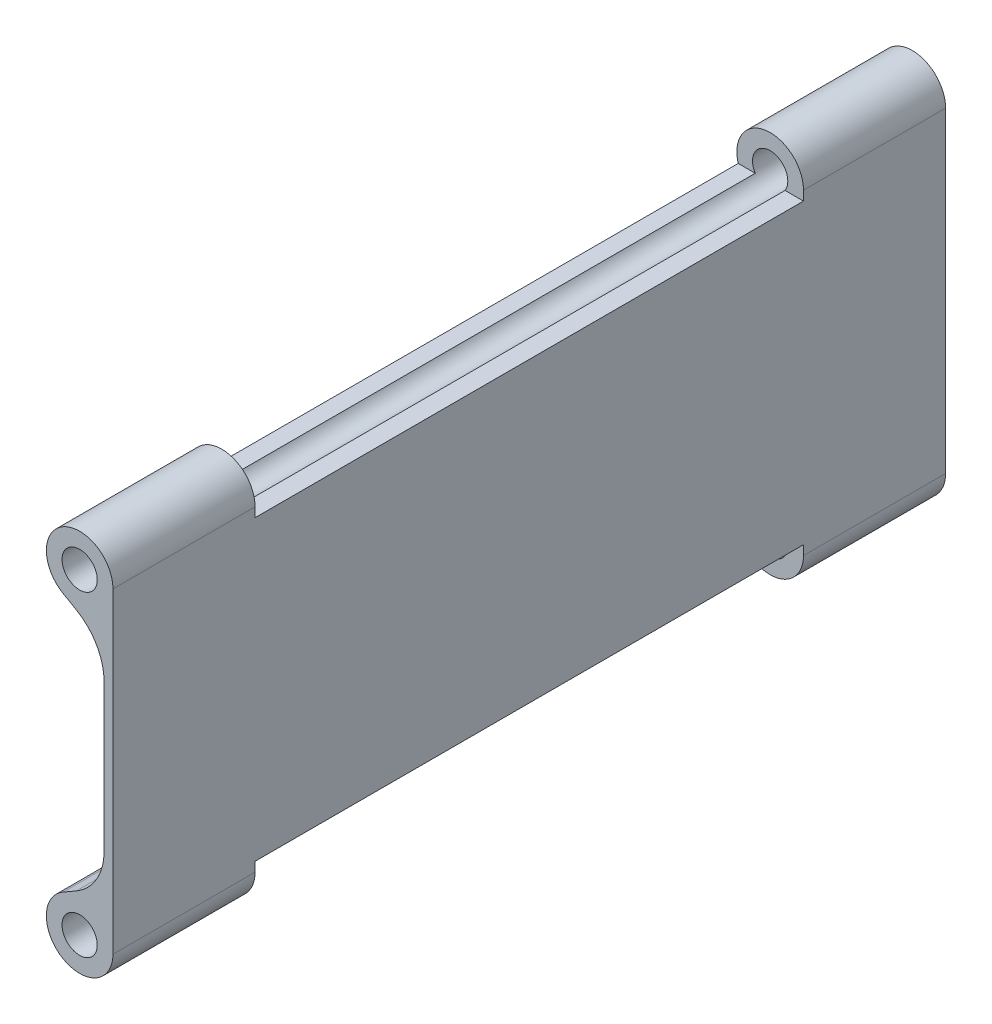
ISO-10303-21;
HEADER;
FILE_DESCRIPTION(('STEP AP214'),'2;1');
FILE_NAME('part.step','',(''),(''),'','','');
FILE_SCHEMA(('AUTOMOTIVE_DESIGN { 1 0 10303 214 1 1 1 1 }'));
ENDSEC;
DATA;
#1=APPLICATION_CONTEXT('core data for automotive mechanical design processes');
#2=APPLICATION_PROTOCOL_DEFINITION('international standard','automotive_design',2000,#1);
#3=PRODUCT_CONTEXT('',#1,'mechanical');
#4=PRODUCT('Part','Part','',(#3));
#5=PRODUCT_RELATED_PRODUCT_CATEGORY('part','',(#4));
#6=PRODUCT_DEFINITION_FORMATION('','',#4);
#7=PRODUCT_DEFINITION_CONTEXT('part definition',#1,'design');
#8=PRODUCT_DEFINITION('design','',#6,#7);
#9=PRODUCT_DEFINITION_SHAPE('','',#8);
#10=(LENGTH_UNIT() NAMED_UNIT(*) SI_UNIT(.MILLI.,.METRE.));
#11=(NAMED_UNIT(*) PLANE_ANGLE_UNIT() SI_UNIT($,.RADIAN.));
#12=(NAMED_UNIT(*) SI_UNIT($,.STERADIAN.) SOLID_ANGLE_UNIT());
#13=UNCERTAINTY_MEASURE_WITH_UNIT(LENGTH_MEASURE(1.E-05),#10,'distance_accuracy_value','');
#14=(GEOMETRIC_REPRESENTATION_CONTEXT(3) GLOBAL_UNCERTAINTY_ASSIGNED_CONTEXT((#13)) GLOBAL_UNIT_ASSIGNED_CONTEXT((#10,
#11,#12)) REPRESENTATION_CONTEXT('',''));
#15=CARTESIAN_POINT('',(0.,0.,0.));
#16=DIRECTION('',(0.,0.,1.));
#17=DIRECTION('',(1.,0.,0.));
#18=AXIS2_PLACEMENT_3D('',#15,#16,#17);
#19=CARTESIAN_POINT('',(-6.,28.5,-150.));
#20=DIRECTION('',(0.,0.,1.));
#21=DIRECTION('',(1.,0.,0.));
#22=AXIS2_PLACEMENT_3D('',#19,#20,#21);
#23=CYLINDRICAL_SURFACE('',#22,6.);
#24=CARTESIAN_POINT('',(-6.,28.5,-25.604093846782));
#25=DIRECTION('',(0.,0.,1.));
#26=DIRECTION('',(0.,-1.,0.));
#27=AXIS2_PLACEMENT_3D('',#24,#25,#26);
#28=CIRCLE('',#27,6.);
#29=CARTESIAN_POINT('',(-11.7548405846867,26.8024105782486,-25.604093846782));
#30=VERTEX_POINT('',#29);
#31=CARTESIAN_POINT('',(0.,28.5,-25.604093846782));
#32=VERTEX_POINT('',#31);
#33=EDGE_CURVE('E230',#30,#32,#28,.F.);
#34=ORIENTED_EDGE('',*,*,#33,.F.);
#35=DIRECTION('',(0.,0.,1.));
#36=VECTOR('',#35,1.);
#37=CARTESIAN_POINT('',(-11.7548405846867,26.8024105782486,-150.));
#38=LINE('',#37,#36);
#39=CARTESIAN_POINT('',(-11.7548405846867,26.8024105782486,-124.395906153218));
#40=VERTEX_POINT('',#39);
#41=EDGE_CURVE('E224',#40,#30,#38,.T.);
#42=ORIENTED_EDGE('',*,*,#41,.F.);
#43=CARTESIAN_POINT('',(-6.,28.5,-124.395906153218));
#44=DIRECTION('',(0.,0.,-1.));
#45=DIRECTION('',(-1.,0.,0.));
#46=AXIS2_PLACEMENT_3D('',#43,#44,#45);
#47=CIRCLE('',#46,6.);
#48=CARTESIAN_POINT('',(0.,28.5,-124.395906153218));
#49=VERTEX_POINT('',#48);
#50=EDGE_CURVE('E227',#49,#40,#47,.F.);
#51=ORIENTED_EDGE('',*,*,#50,.F.);
#52=DIRECTION('',(0.,0.,1.));
#53=VECTOR('',#52,1.);
#54=CARTESIAN_POINT('',(0.,28.5,-150.));
#55=LINE('',#54,#53);
#56=CARTESIAN_POINT('',(0.,28.5,-150.));
#57=VERTEX_POINT('',#56);
#58=EDGE_CURVE('E189',#57,#49,#55,.T.);
#59=ORIENTED_EDGE('',*,*,#58,.F.);
#60=CARTESIAN_POINT('',(-6.,28.5,-150.));
#61=DIRECTION('',(0.,0.,1.));
#62=DIRECTION('',(1.,0.,0.));
#63=AXIS2_PLACEMENT_3D('',#60,#61,#62);
#64=CIRCLE('',#63,6.);
#65=CARTESIAN_POINT('',(-8.98691390995377,23.2963142586697,-150.));
#66=VERTEX_POINT('',#65);
#67=EDGE_CURVE('E250',#57,#66,#64,.T.);
#68=ORIENTED_EDGE('',*,*,#67,.T.);
#69=DIRECTION('',(0.,0.,1.));
#70=VECTOR('',#69,1.);
#71=CARTESIAN_POINT('',(-8.98691390995377,23.2963142586697,-150.));
#72=LINE('',#71,#70);
#73=CARTESIAN_POINT('',(-8.98691390995377,23.2963142586697,0.));
#74=VERTEX_POINT('',#73);
#75=EDGE_CURVE('E273',#66,#74,#72,.T.);
#76=ORIENTED_EDGE('',*,*,#75,.T.);
#77=CARTESIAN_POINT('',(-6.,28.5,0.));
#78=DIRECTION('',(0.,0.,1.));
#79=DIRECTION('',(1.,0.,0.));
#80=AXIS2_PLACEMENT_3D('',#77,#78,#79);
#81=CIRCLE('',#80,6.);
#82=CARTESIAN_POINT('',(0.,28.5,0.));
#83=VERTEX_POINT('',#82);
#84=EDGE_CURVE('E246',#83,#74,#81,.T.);
#85=ORIENTED_EDGE('',*,*,#84,.F.);
#86=EDGE_CURVE('E298',#32,#83,#55,.T.);
#87=ORIENTED_EDGE('',*,*,#86,.F.);
#88=EDGE_LOOP('',(#34,#42,#51,#59,#68,#76,#85,#87));
#89=FACE_BOUND('',#88,.T.);
#90=ADVANCED_FACE('F39',(#89),#23,.T.);
#91=CARTESIAN_POINT('',(0.,28.5,-150.));
#92=DIRECTION('',(1.,0.,0.));
#93=DIRECTION('',(0.,0.,-1.));
#94=AXIS2_PLACEMENT_3D('',#91,#92,#93);
#95=PLANE('',#94);
#96=DIRECTION('',(0.,-1.,0.));
#97=VECTOR('',#96,1.);
#98=CARTESIAN_POINT('',(0.,44.9478454916756,-25.604093846782));
#99=LINE('',#98,#97);
#100=CARTESIAN_POINT('',(0.,26.8024105782486,-25.604093846782));
#101=VERTEX_POINT('',#100);
#102=EDGE_CURVE('E185',#32,#101,#99,.T.);
#103=ORIENTED_EDGE('',*,*,#102,.F.);
#104=ORIENTED_EDGE('',*,*,#86,.T.);
#105=DIRECTION('',(0.,1.,0.));
#106=VECTOR('',#105,1.);
#107=CARTESIAN_POINT('',(0.,28.5,0.));
#108=LINE('',#107,#106);
#109=CARTESIAN_POINT('',(0.,-28.5,0.));
#110=VERTEX_POINT('',#109);
#111=EDGE_CURVE('E255',#110,#83,#108,.T.);
#112=ORIENTED_EDGE('',*,*,#111,.F.);
#113=DIRECTION('',(0.,0.,1.));
#114=VECTOR('',#113,1.);
#115=CARTESIAN_POINT('',(0.,-28.5,-150.));
#116=LINE('',#115,#114);
#117=CARTESIAN_POINT('',(0.,-28.5,-25.604093846782));
#118=VERTEX_POINT('',#117);
#119=EDGE_CURVE('E302',#118,#110,#116,.T.);
#120=ORIENTED_EDGE('',*,*,#119,.F.);
#121=DIRECTION('',(0.,-1.,0.));
#122=VECTOR('',#121,1.);
#123=CARTESIAN_POINT('',(0.,-44.9478454916756,-25.604093846782));
#124=LINE('',#123,#122);
#125=CARTESIAN_POINT('',(0.,-26.8024105782486,-25.604093846782));
#126=VERTEX_POINT('',#125);
#127=EDGE_CURVE('E204',#126,#118,#124,.T.);
#128=ORIENTED_EDGE('',*,*,#127,.F.);
#129=DIRECTION('',(0.,0.,1.));
#130=VECTOR('',#129,1.);
#131=CARTESIAN_POINT('',(0.,-26.8024105782486,-25.604093846782));
#132=LINE('',#131,#130);
#133=CARTESIAN_POINT('',(0.,-26.8024105782486,-124.395906153218));
#134=VERTEX_POINT('',#133);
#135=EDGE_CURVE('E200',#134,#126,#132,.T.);
#136=ORIENTED_EDGE('',*,*,#135,.F.);
#137=DIRECTION('',(0.,1.,0.));
#138=VECTOR('',#137,1.);
#139=CARTESIAN_POINT('',(0.,-44.9478454916756,-124.395906153218));
#140=LINE('',#139,#138);
#141=CARTESIAN_POINT('',(0.,-28.5,-124.395906153218));
#142=VERTEX_POINT('',#141);
#143=EDGE_CURVE('E196',#142,#134,#140,.T.);
#144=ORIENTED_EDGE('',*,*,#143,.F.);
#145=CARTESIAN_POINT('',(0.,-28.5,-150.));
#146=VERTEX_POINT('',#145);
#147=EDGE_CURVE('E299',#146,#142,#116,.T.);
#148=ORIENTED_EDGE('',*,*,#147,.F.);
#149=DIRECTION('',(0.,1.,0.));
#150=VECTOR('',#149,1.);
#151=CARTESIAN_POINT('',(0.,28.5,-150.));
#152=LINE('',#151,#150);
#153=EDGE_CURVE('E270',#146,#57,#152,.T.);
#154=ORIENTED_EDGE('',*,*,#153,.T.);
#155=ORIENTED_EDGE('',*,*,#58,.T.);
#156=DIRECTION('',(0.,1.,0.));
#157=VECTOR('',#156,1.);
#158=CARTESIAN_POINT('',(0.,44.9478454916756,-124.395906153218));
#159=LINE('',#158,#157);
#160=CARTESIAN_POINT('',(0.,26.8024105782486,-124.395906153218));
#161=VERTEX_POINT('',#160);
#162=EDGE_CURVE('E170',#161,#49,#159,.T.);
#163=ORIENTED_EDGE('',*,*,#162,.F.);
#164=DIRECTION('',(0.,0.,-1.));
#165=VECTOR('',#164,1.);
#166=CARTESIAN_POINT('',(0.,26.8024105782486,-25.604093846782));
#167=LINE('',#166,#165);
#168=EDGE_CURVE('E180',#101,#161,#167,.T.);
#169=ORIENTED_EDGE('',*,*,#168,.F.);
#170=EDGE_LOOP('',(#103,#104,#112,#120,#128,#136,#144,#148,#154,#155,#163,#169));
#171=FACE_BOUND('',#170,.T.);
#172=ADVANCED_FACE('F187',(#171),#95,.T.);
#173=CARTESIAN_POINT('',(-6.,-28.5,-150.));
#174=DIRECTION('',(0.,0.,1.));
#175=DIRECTION('',(1.,0.,0.));
#176=AXIS2_PLACEMENT_3D('',#173,#174,#175);
#177=CYLINDRICAL_SURFACE('',#176,6.);
#178=CARTESIAN_POINT('',(-6.,-28.5,-124.395906153218));
#179=DIRECTION('',(0.,0.,-1.));
#180=DIRECTION('',(-1.,0.,0.));
#181=AXIS2_PLACEMENT_3D('',#178,#179,#180);
#182=CIRCLE('',#181,6.);
#183=CARTESIAN_POINT('',(-11.7548405846867,-26.8024105782486,-124.395906153218));
#184=VERTEX_POINT('',#183);
#185=EDGE_CURVE('E63',#184,#142,#182,.F.);
#186=ORIENTED_EDGE('',*,*,#185,.F.);
#187=DIRECTION('',(0.,0.,1.));
#188=VECTOR('',#187,1.);
#189=CARTESIAN_POINT('',(-11.7548405846867,-26.8024105782486,-150.));
#190=LINE('',#189,#188);
#191=CARTESIAN_POINT('',(-11.7548405846867,-26.8024105782486,-25.604093846782));
#192=VERTEX_POINT('',#191);
#193=EDGE_CURVE('E217',#192,#184,#190,.F.);
#194=ORIENTED_EDGE('',*,*,#193,.F.);
#195=CARTESIAN_POINT('',(-6.,-28.5,-25.604093846782));
#196=DIRECTION('',(0.,0.,1.));
#197=DIRECTION('',(1.,0.,0.));
#198=AXIS2_PLACEMENT_3D('',#195,#196,#197);
#199=CIRCLE('',#198,6.);
#200=EDGE_CURVE('E221',#118,#192,#199,.F.);
#201=ORIENTED_EDGE('',*,*,#200,.F.);
#202=ORIENTED_EDGE('',*,*,#119,.T.);
#203=CARTESIAN_POINT('',(-6.,-28.5,0.));
#204=DIRECTION('',(0.,0.,1.));
#205=DIRECTION('',(-1.,0.,0.));
#206=AXIS2_PLACEMENT_3D('',#203,#204,#205);
#207=CIRCLE('',#206,6.);
#208=CARTESIAN_POINT('',(-8.98691390995377,-23.2963142586697,0.));
#209=VERTEX_POINT('',#208);
#210=EDGE_CURVE('E288',#209,#110,#207,.T.);
#211=ORIENTED_EDGE('',*,*,#210,.F.);
#212=DIRECTION('',(0.,0.,1.));
#213=VECTOR('',#212,1.);
#214=CARTESIAN_POINT('',(-8.98691390995377,-23.2963142586697,-150.));
#215=LINE('',#214,#213);
#216=CARTESIAN_POINT('',(-8.98691390995377,-23.2963142586697,-150.));
#217=VERTEX_POINT('',#216);
#218=EDGE_CURVE('E303',#217,#209,#215,.T.);
#219=ORIENTED_EDGE('',*,*,#218,.F.);
#220=CARTESIAN_POINT('',(-6.,-28.5,-150.));
#221=DIRECTION('',(0.,0.,1.));
#222=DIRECTION('',(-1.,0.,0.));
#223=AXIS2_PLACEMENT_3D('',#220,#221,#222);
#224=CIRCLE('',#223,6.);
#225=EDGE_CURVE('E266',#217,#146,#224,.T.);
#226=ORIENTED_EDGE('',*,*,#225,.T.);
#227=ORIENTED_EDGE('',*,*,#147,.T.);
#228=EDGE_LOOP('',(#186,#194,#201,#202,#211,#219,#226,#227));
#229=FACE_BOUND('',#228,.T.);
#230=ADVANCED_FACE('F384',(#229),#177,.T.);
#231=CARTESIAN_POINT('',(-1.59999999999999,-19.056228095505,-150.));
#232=DIRECTION('',(-0.497818984992297,0.867280956888389,0.));
#233=DIRECTION('',(-0.867280956888389,-0.497818984992297,0.));
#234=AXIS2_PLACEMENT_3D('',#231,#232,#233);
#235=PLANE('',#234);
#236=DIRECTION('',(-0.867280956888389,-0.497818984992297,0.));
#237=VECTOR('',#236,1.);
#238=CARTESIAN_POINT('',(-1.59999999999999,-19.056228095505,0.));
#239=LINE('',#238,#237);
#240=CARTESIAN_POINT('',(-6.62181015007702,-21.9387454756913,0.));
#241=VERTEX_POINT('',#240);
#242=EDGE_CURVE('E285',#241,#209,#239,.T.);
#243=ORIENTED_EDGE('',*,*,#242,.F.);
#244=DIRECTION('',(0.,0.,1.));
#245=VECTOR('',#244,1.);
#246=CARTESIAN_POINT('',(-6.62181015007702,-21.9387454756913,-150.));
#247=LINE('',#246,#245);
#248=CARTESIAN_POINT('',(-6.62181015007702,-21.9387454756913,-150.));
#249=VERTEX_POINT('',#248);
#250=EDGE_CURVE('E315',#241,#249,#247,.F.);
#251=ORIENTED_EDGE('',*,*,#250,.T.);
#252=DIRECTION('',(-0.867280956888389,-0.497818984992297,0.));
#253=VECTOR('',#252,1.);
#254=CARTESIAN_POINT('',(-1.59999999999999,-19.056228095505,-150.));
#255=LINE('',#254,#253);
#256=EDGE_CURVE('E263',#249,#217,#255,.T.);
#257=ORIENTED_EDGE('',*,*,#256,.T.);
#258=ORIENTED_EDGE('',*,*,#218,.T.);
#259=EDGE_LOOP('',(#243,#251,#257,#258));
#260=FACE_BOUND('',#259,.T.);
#261=ADVANCED_FACE('F453',(#260),#235,.T.);
#262=CARTESIAN_POINT('',(-1.59999999999999,19.056228095505,-150.));
#263=DIRECTION('',(-1.,0.,0.));
#264=DIRECTION('',(0.,0.,1.));
#265=AXIS2_PLACEMENT_3D('',#262,#263,#264);
#266=PLANE('',#265);
#267=DIRECTION('',(0.,-1.,0.));
#268=VECTOR('',#267,1.);
#269=CARTESIAN_POINT('',(-1.59999999999999,19.056228095505,-150.));
#270=LINE('',#269,#268);
#271=CARTESIAN_POINT('',(-1.59999999999999,13.2659359068074,-150.));
#272=VERTEX_POINT('',#271);
#273=CARTESIAN_POINT('',(-1.59999999999999,-13.2659359068074,-150.));
#274=VERTEX_POINT('',#273);
#275=EDGE_CURVE('E259',#272,#274,#270,.T.);
#276=ORIENTED_EDGE('',*,*,#275,.T.);
#277=DIRECTION('',(0.,0.,1.));
#278=VECTOR('',#277,1.);
#279=CARTESIAN_POINT('',(-1.59999999999999,-13.2659359068074,0.));
#280=LINE('',#279,#278);
#281=CARTESIAN_POINT('',(-1.59999999999999,-13.2659359068074,0.));
#282=VERTEX_POINT('',#281);
#283=EDGE_CURVE('E311',#274,#282,#280,.T.);
#284=ORIENTED_EDGE('',*,*,#283,.T.);
#285=DIRECTION('',(0.,-1.,0.));
#286=VECTOR('',#285,1.);
#287=CARTESIAN_POINT('',(-1.59999999999999,19.056228095505,0.));
#288=LINE('',#287,#286);
#289=CARTESIAN_POINT('',(-1.59999999999999,13.2659359068074,0.));
#290=VERTEX_POINT('',#289);
#291=EDGE_CURVE('E281',#290,#282,#288,.T.);
#292=ORIENTED_EDGE('',*,*,#291,.F.);
#293=DIRECTION('',(0.,0.,1.));
#294=VECTOR('',#293,1.);
#295=CARTESIAN_POINT('',(-1.59999999999999,13.2659359068074,-150.));
#296=LINE('',#295,#294);
#297=EDGE_CURVE('E297',#290,#272,#296,.F.);
#298=ORIENTED_EDGE('',*,*,#297,.T.);
#299=EDGE_LOOP('',(#276,#284,#292,#298));
#300=FACE_BOUND('',#299,.T.);
#301=ADVANCED_FACE('F448',(#300),#266,.T.);
#302=CARTESIAN_POINT('',(-1.59999999999999,19.056228095505,-150.));
#303=DIRECTION('',(-0.497818984992297,-0.867280956888389,0.));
#304=DIRECTION('',(0.867280956888389,-0.497818984992297,0.));
#305=AXIS2_PLACEMENT_3D('',#302,#303,#304);
#306=PLANE('',#305);
#307=DIRECTION('',(0.867280956888389,-0.497818984992297,0.));
#308=VECTOR('',#307,1.);
#309=CARTESIAN_POINT('',(-1.59999999999999,19.056228095505,-150.));
#310=LINE('',#309,#308);
#311=CARTESIAN_POINT('',(-6.62181015007702,21.9387454756913,-150.));
#312=VERTEX_POINT('',#311);
#313=EDGE_CURVE('E254',#66,#312,#310,.T.);
#314=ORIENTED_EDGE('',*,*,#313,.T.);
#315=DIRECTION('',(0.,0.,1.));
#316=VECTOR('',#315,1.);
#317=CARTESIAN_POINT('',(-6.62181015007702,21.9387454756913,0.));
#318=LINE('',#317,#316);
#319=CARTESIAN_POINT('',(-6.62181015007702,21.9387454756913,0.));
#320=VERTEX_POINT('',#319);
#321=EDGE_CURVE('E318',#312,#320,#318,.T.);
#322=ORIENTED_EDGE('',*,*,#321,.T.);
#323=DIRECTION('',(0.867280956888389,-0.497818984992297,0.));
#324=VECTOR('',#323,1.);
#325=CARTESIAN_POINT('',(-1.59999999999999,19.056228095505,0.));
#326=LINE('',#325,#324);
#327=EDGE_CURVE('E277',#74,#320,#326,.T.);
#328=ORIENTED_EDGE('',*,*,#327,.F.);
#329=ORIENTED_EDGE('',*,*,#75,.F.);
#330=EDGE_LOOP('',(#314,#322,#328,#329));
#331=FACE_BOUND('',#330,.T.);
#332=ADVANCED_FACE('F432',(#331),#306,.T.);
#333=CARTESIAN_POINT('',(-6.,28.5,-150.));
#334=DIRECTION('',(0.,0.,1.));
#335=DIRECTION('',(1.,0.,0.));
#336=AXIS2_PLACEMENT_3D('',#333,#334,#335);
#337=PLANE('',#336);
#338=CARTESIAN_POINT('',(-6.,-28.5,-150.));
#339=DIRECTION('',(0.,0.,1.));
#340=DIRECTION('',(-1.,0.,0.));
#341=AXIS2_PLACEMENT_3D('',#338,#339,#340);
#342=CIRCLE('',#341,3.175);
#343=CARTESIAN_POINT('',(-9.175,-28.5,-150.));
#344=VERTEX_POINT('',#343);
#345=EDGE_CURVE('E234',#344,#344,#342,.T.);
#346=ORIENTED_EDGE('',*,*,#345,.T.);
#347=EDGE_LOOP('',(#346));
#348=FACE_BOUND('',#347,.T.);
#349=CARTESIAN_POINT('',(-6.,28.5,-150.));
#350=DIRECTION('',(0.,0.,1.));
#351=DIRECTION('',(1.,0.,0.));
#352=AXIS2_PLACEMENT_3D('',#349,#350,#351);
#353=CIRCLE('',#352,3.175);
#354=CARTESIAN_POINT('',(-2.825,28.5,-150.));
#355=VERTEX_POINT('',#354);
#356=EDGE_CURVE('E242',#355,#355,#353,.T.);
#357=ORIENTED_EDGE('',*,*,#356,.T.);
#358=EDGE_LOOP('',(#357));
#359=FACE_BOUND('',#358,.T.);
#360=ORIENTED_EDGE('',*,*,#67,.F.);
#361=ORIENTED_EDGE('',*,*,#153,.F.);
#362=ORIENTED_EDGE('',*,*,#225,.F.);
#363=ORIENTED_EDGE('',*,*,#256,.F.);
#364=CARTESIAN_POINT('',(-11.6,-13.2659359068074,-150.));
#365=DIRECTION('',(0.,0.,1.));
#366=DIRECTION('',(1.,0.,0.));
#367=AXIS2_PLACEMENT_3D('',#364,#365,#366);
#368=CIRCLE('',#367,10.);
#369=EDGE_CURVE('E325',#249,#274,#368,.T.);
#370=ORIENTED_EDGE('',*,*,#369,.T.);
#371=ORIENTED_EDGE('',*,*,#275,.F.);
#372=CARTESIAN_POINT('',(-11.6,13.2659359068074,-150.));
#373=DIRECTION('',(0.,0.,1.));
#374=DIRECTION('',(1.,0.,0.));
#375=AXIS2_PLACEMENT_3D('',#372,#373,#374);
#376=CIRCLE('',#375,10.);
#377=EDGE_CURVE('E331',#272,#312,#376,.T.);
#378=ORIENTED_EDGE('',*,*,#377,.T.);
#379=ORIENTED_EDGE('',*,*,#313,.F.);
#380=EDGE_LOOP('',(#360,#361,#362,#363,#370,#371,#378,#379));
#381=FACE_BOUND('',#380,.T.);
#382=ADVANCED_FACE('F408',(#348,#359,#381),#337,.F.);
#383=CARTESIAN_POINT('',(-6.,28.5,0.));
#384=DIRECTION('',(0.,0.,1.));
#385=DIRECTION('',(1.,0.,0.));
#386=AXIS2_PLACEMENT_3D('',#383,#384,#385);
#387=PLANE('',#386);
#388=CARTESIAN_POINT('',(-6.,-28.5,0.));
#389=DIRECTION('',(0.,0.,1.));
#390=DIRECTION('',(-1.,0.,0.));
#391=AXIS2_PLACEMENT_3D('',#388,#389,#390);
#392=CIRCLE('',#391,3.175);
#393=CARTESIAN_POINT('',(-9.175,-28.5,0.));
#394=VERTEX_POINT('',#393);
#395=EDGE_CURVE('E233',#394,#394,#392,.T.);
#396=ORIENTED_EDGE('',*,*,#395,.F.);
#397=EDGE_LOOP('',(#396));
#398=FACE_BOUND('',#397,.T.);
#399=CARTESIAN_POINT('',(-6.,28.5,0.));
#400=DIRECTION('',(0.,0.,1.));
#401=DIRECTION('',(1.,0.,0.));
#402=AXIS2_PLACEMENT_3D('',#399,#400,#401);
#403=CIRCLE('',#402,3.175);
#404=CARTESIAN_POINT('',(-2.825,28.5,0.));
#405=VERTEX_POINT('',#404);
#406=EDGE_CURVE('E238',#405,#405,#403,.T.);
#407=ORIENTED_EDGE('',*,*,#406,.F.);
#408=EDGE_LOOP('',(#407));
#409=FACE_BOUND('',#408,.T.);
#410=ORIENTED_EDGE('',*,*,#84,.T.);
#411=ORIENTED_EDGE('',*,*,#327,.T.);
#412=CARTESIAN_POINT('',(-11.6,13.2659359068074,0.));
#413=DIRECTION('',(0.,0.,1.));
#414=DIRECTION('',(1.,0.,0.));
#415=AXIS2_PLACEMENT_3D('',#412,#413,#414);
#416=CIRCLE('',#415,10.);
#417=EDGE_CURVE('E328',#320,#290,#416,.F.);
#418=ORIENTED_EDGE('',*,*,#417,.T.);
#419=ORIENTED_EDGE('',*,*,#291,.T.);
#420=CARTESIAN_POINT('',(-11.6,-13.2659359068074,0.));
#421=DIRECTION('',(0.,0.,1.));
#422=DIRECTION('',(1.,0.,0.));
#423=AXIS2_PLACEMENT_3D('',#420,#421,#422);
#424=CIRCLE('',#423,10.);
#425=EDGE_CURVE('E322',#282,#241,#424,.F.);
#426=ORIENTED_EDGE('',*,*,#425,.T.);
#427=ORIENTED_EDGE('',*,*,#242,.T.);
#428=ORIENTED_EDGE('',*,*,#210,.T.);
#429=ORIENTED_EDGE('',*,*,#111,.T.);
#430=EDGE_LOOP('',(#410,#411,#418,#419,#426,#427,#428,#429));
#431=FACE_BOUND('',#430,.T.);
#432=ADVANCED_FACE('F399',(#398,#409,#431),#387,.T.);
#433=CARTESIAN_POINT('',(-6.,28.5,-150.));
#434=DIRECTION('',(0.,0.,1.));
#435=DIRECTION('',(1.,0.,0.));
#436=AXIS2_PLACEMENT_3D('',#433,#434,#435);
#437=CYLINDRICAL_SURFACE('',#436,3.175);
#438=CARTESIAN_POINT('',(-6.,28.5,-25.604093846782));
#439=DIRECTION('',(0.,0.,1.));
#440=DIRECTION('',(0.,-1.,0.));
#441=AXIS2_PLACEMENT_3D('',#438,#439,#440);
#442=CIRCLE('',#441,3.175);
#443=CARTESIAN_POINT('',(-8.68306078111506,26.8024105782486,-25.604093846782));
#444=VERTEX_POINT('',#443);
#445=CARTESIAN_POINT('',(-3.31693921888494,26.8024105782486,-25.604093846782));
#446=VERTEX_POINT('',#445);
#447=EDGE_CURVE('E48',#444,#446,#442,.F.);
#448=ORIENTED_EDGE('',*,*,#447,.T.);
#449=DIRECTION('',(0.,0.,1.));
#450=VECTOR('',#449,1.);
#451=CARTESIAN_POINT('',(-3.31693921888494,26.8024105782486,-150.));
#452=LINE('',#451,#450);
#453=CARTESIAN_POINT('',(-3.31693921888494,26.8024105782486,-124.395906153218));
#454=VERTEX_POINT('',#453);
#455=EDGE_CURVE('E11',#446,#454,#452,.F.);
#456=ORIENTED_EDGE('',*,*,#455,.T.);
#457=CARTESIAN_POINT('',(-6.,28.5,-124.395906153218));
#458=DIRECTION('',(0.,0.,-1.));
#459=DIRECTION('',(-1.,0.,0.));
#460=AXIS2_PLACEMENT_3D('',#457,#458,#459);
#461=CIRCLE('',#460,3.175);
#462=CARTESIAN_POINT('',(-8.68306078111506,26.8024105782486,-124.395906153218));
#463=VERTEX_POINT('',#462);
#464=EDGE_CURVE('E174',#454,#463,#461,.F.);
#465=ORIENTED_EDGE('',*,*,#464,.T.);
#466=DIRECTION('',(0.,0.,1.));
#467=VECTOR('',#466,1.);
#468=CARTESIAN_POINT('',(-8.68306078111506,26.8024105782486,-150.));
#469=LINE('',#468,#467);
#470=EDGE_CURVE('E350',#463,#444,#469,.T.);
#471=ORIENTED_EDGE('',*,*,#470,.T.);
#472=EDGE_LOOP('',(#448,#456,#465,#471));
#473=FACE_BOUND('',#472,.T.);
#474=ORIENTED_EDGE('',*,*,#356,.F.);
#475=EDGE_LOOP('',(#474));
#476=FACE_BOUND('',#475,.T.);
#477=ORIENTED_EDGE('',*,*,#406,.T.);
#478=EDGE_LOOP('',(#477));
#479=FACE_BOUND('',#478,.T.);
#480=ADVANCED_FACE('F359',(#473,#476,#479),#437,.F.);
#481=CARTESIAN_POINT('',(-6.,-28.5,-150.));
#482=DIRECTION('',(0.,0.,1.));
#483=DIRECTION('',(1.,0.,0.));
#484=AXIS2_PLACEMENT_3D('',#481,#482,#483);
#485=CYLINDRICAL_SURFACE('',#484,3.175);
#486=DIRECTION('',(0.,0.,1.));
#487=VECTOR('',#486,1.);
#488=CARTESIAN_POINT('',(-3.31693921888494,-26.8024105782486,-150.));
#489=LINE('',#488,#487);
#490=CARTESIAN_POINT('',(-3.31693921888494,-26.8024105782486,-124.395906153218));
#491=VERTEX_POINT('',#490);
#492=CARTESIAN_POINT('',(-3.31693921888494,-26.8024105782486,-25.604093846782));
#493=VERTEX_POINT('',#492);
#494=EDGE_CURVE('E338',#491,#493,#489,.T.);
#495=ORIENTED_EDGE('',*,*,#494,.T.);
#496=CARTESIAN_POINT('',(-6.,-28.5,-25.604093846782));
#497=DIRECTION('',(0.,0.,1.));
#498=DIRECTION('',(1.,0.,0.));
#499=AXIS2_PLACEMENT_3D('',#496,#497,#498);
#500=CIRCLE('',#499,3.175);
#501=CARTESIAN_POINT('',(-8.68306078111506,-26.8024105782486,-25.604093846782));
#502=VERTEX_POINT('',#501);
#503=EDGE_CURVE('E346',#493,#502,#500,.F.);
#504=ORIENTED_EDGE('',*,*,#503,.T.);
#505=DIRECTION('',(0.,0.,1.));
#506=VECTOR('',#505,1.);
#507=CARTESIAN_POINT('',(-8.68306078111506,-26.8024105782486,-150.));
#508=LINE('',#507,#506);
#509=CARTESIAN_POINT('',(-8.68306078111506,-26.8024105782486,-124.395906153218));
#510=VERTEX_POINT('',#509);
#511=EDGE_CURVE('E342',#502,#510,#508,.F.);
#512=ORIENTED_EDGE('',*,*,#511,.T.);
#513=CARTESIAN_POINT('',(-6.,-28.5,-124.395906153218));
#514=DIRECTION('',(0.,0.,-1.));
#515=DIRECTION('',(-1.,0.,0.));
#516=AXIS2_PLACEMENT_3D('',#513,#514,#515);
#517=CIRCLE('',#516,3.175);
#518=EDGE_CURVE('E334',#510,#491,#517,.F.);
#519=ORIENTED_EDGE('',*,*,#518,.T.);
#520=EDGE_LOOP('',(#495,#504,#512,#519));
#521=FACE_BOUND('',#520,.T.);
#522=ORIENTED_EDGE('',*,*,#345,.F.);
#523=EDGE_LOOP('',(#522));
#524=FACE_BOUND('',#523,.T.);
#525=ORIENTED_EDGE('',*,*,#395,.T.);
#526=EDGE_LOOP('',(#525));
#527=FACE_BOUND('',#526,.T.);
#528=ADVANCED_FACE('F376',(#521,#524,#527),#485,.F.);
#529=CARTESIAN_POINT('',(-11.6,-13.2659359068074,-150.));
#530=DIRECTION('',(0.,0.,-1.));
#531=DIRECTION('',(-1.,0.,0.));
#532=AXIS2_PLACEMENT_3D('',#529,#530,#531);
#533=CYLINDRICAL_SURFACE('',#532,10.);
#534=ORIENTED_EDGE('',*,*,#369,.F.);
#535=ORIENTED_EDGE('',*,*,#250,.F.);
#536=ORIENTED_EDGE('',*,*,#425,.F.);
#537=ORIENTED_EDGE('',*,*,#283,.F.);
#538=EDGE_LOOP('',(#534,#535,#536,#537));
#539=FACE_BOUND('',#538,.T.);
#540=ADVANCED_FACE('F434',(#539),#533,.F.);
#541=CARTESIAN_POINT('',(-11.6,13.2659359068074,-150.));
#542=DIRECTION('',(0.,0.,-1.));
#543=DIRECTION('',(-1.,0.,0.));
#544=AXIS2_PLACEMENT_3D('',#541,#542,#543);
#545=CYLINDRICAL_SURFACE('',#544,10.);
#546=ORIENTED_EDGE('',*,*,#377,.F.);
#547=ORIENTED_EDGE('',*,*,#297,.F.);
#548=ORIENTED_EDGE('',*,*,#417,.F.);
#549=ORIENTED_EDGE('',*,*,#321,.F.);
#550=EDGE_LOOP('',(#546,#547,#548,#549));
#551=FACE_BOUND('',#550,.T.);
#552=ADVANCED_FACE('F41',(#551),#545,.F.);
#553=CARTESIAN_POINT('',(-12.,-44.9478454916756,-25.604093846782));
#554=DIRECTION('',(0.,0.,1.));
#555=DIRECTION('',(1.,0.,0.));
#556=AXIS2_PLACEMENT_3D('',#553,#554,#555);
#557=PLANE('',#556);
#558=ORIENTED_EDGE('',*,*,#200,.T.);
#559=DIRECTION('',(1.,0.,0.));
#560=VECTOR('',#559,1.);
#561=CARTESIAN_POINT('',(-12.,-26.8024105782486,-25.604093846782));
#562=LINE('',#561,#560);
#563=EDGE_CURVE('E211',#192,#502,#562,.T.);
#564=ORIENTED_EDGE('',*,*,#563,.T.);
#565=ORIENTED_EDGE('',*,*,#503,.F.);
#566=EDGE_CURVE('E208',#493,#126,#562,.T.);
#567=ORIENTED_EDGE('',*,*,#566,.T.);
#568=ORIENTED_EDGE('',*,*,#127,.T.);
#569=EDGE_LOOP('',(#558,#564,#565,#567,#568));
#570=FACE_BOUND('',#569,.T.);
#571=ADVANCED_FACE('F371',(#570),#557,.F.);
#572=CARTESIAN_POINT('',(-12.,-26.8024105782486,-25.604093846782));
#573=DIRECTION('',(0.,1.,0.));
#574=DIRECTION('',(0.,0.,1.));
#575=AXIS2_PLACEMENT_3D('',#572,#573,#574);
#576=PLANE('',#575);
#577=ORIENTED_EDGE('',*,*,#193,.T.);
#578=DIRECTION('',(1.,0.,0.));
#579=VECTOR('',#578,1.);
#580=CARTESIAN_POINT('',(-12.,-26.8024105782486,-124.395906153218));
#581=LINE('',#580,#579);
#582=EDGE_CURVE('E212',#184,#510,#581,.T.);
#583=ORIENTED_EDGE('',*,*,#582,.T.);
#584=ORIENTED_EDGE('',*,*,#511,.F.);
#585=ORIENTED_EDGE('',*,*,#563,.F.);
#586=EDGE_LOOP('',(#577,#583,#584,#585));
#587=FACE_BOUND('',#586,.T.);
#588=ADVANCED_FACE('F416',(#587),#576,.F.);
#589=EDGE_CURVE('E207',#491,#134,#581,.T.);
#590=ORIENTED_EDGE('',*,*,#589,.T.);
#591=ORIENTED_EDGE('',*,*,#135,.T.);
#592=ORIENTED_EDGE('',*,*,#566,.F.);
#593=ORIENTED_EDGE('',*,*,#494,.F.);
#594=EDGE_LOOP('',(#590,#591,#592,#593));
#595=FACE_BOUND('',#594,.T.);
#596=ADVANCED_FACE('F380',(#595),#576,.F.);
#597=CARTESIAN_POINT('',(-12.,-44.9478454916756,-124.395906153218));
#598=DIRECTION('',(0.,0.,-1.));
#599=DIRECTION('',(-1.,0.,0.));
#600=AXIS2_PLACEMENT_3D('',#597,#598,#599);
#601=PLANE('',#600);
#602=ORIENTED_EDGE('',*,*,#185,.T.);
#603=ORIENTED_EDGE('',*,*,#143,.T.);
#604=ORIENTED_EDGE('',*,*,#589,.F.);
#605=ORIENTED_EDGE('',*,*,#518,.F.);
#606=ORIENTED_EDGE('',*,*,#582,.F.);
#607=EDGE_LOOP('',(#602,#603,#604,#605,#606));
#608=FACE_BOUND('',#607,.T.);
#609=ADVANCED_FACE('F413',(#608),#601,.F.);
#610=CARTESIAN_POINT('',(-12.,44.9478454916756,-25.604093846782));
#611=DIRECTION('',(0.,0.,1.));
#612=DIRECTION('',(0.,-1.,0.));
#613=AXIS2_PLACEMENT_3D('',#610,#611,#612);
#614=PLANE('',#613);
#615=ORIENTED_EDGE('',*,*,#33,.T.);
#616=ORIENTED_EDGE('',*,*,#102,.T.);
#617=DIRECTION('',(1.,0.,0.));
#618=VECTOR('',#617,1.);
#619=CARTESIAN_POINT('',(-12.,26.8024105782486,-25.604093846782));
#620=LINE('',#619,#618);
#621=EDGE_CURVE('E55',#446,#101,#620,.T.);
#622=ORIENTED_EDGE('',*,*,#621,.F.);
#623=ORIENTED_EDGE('',*,*,#447,.F.);
#624=EDGE_CURVE('E177',#30,#444,#620,.T.);
#625=ORIENTED_EDGE('',*,*,#624,.F.);
#626=EDGE_LOOP('',(#615,#616,#622,#623,#625));
#627=FACE_BOUND('',#626,.T.);
#628=ADVANCED_FACE('F363',(#627),#614,.F.);
#629=CARTESIAN_POINT('',(-12.,44.9478454916756,-124.395906153218));
#630=DIRECTION('',(0.,0.,-1.));
#631=DIRECTION('',(-1.,0.,0.));
#632=AXIS2_PLACEMENT_3D('',#629,#630,#631);
#633=PLANE('',#632);
#634=ORIENTED_EDGE('',*,*,#50,.T.);
#635=DIRECTION('',(1.,0.,0.));
#636=VECTOR('',#635,1.);
#637=CARTESIAN_POINT('',(-12.,26.8024105782486,-124.395906153218));
#638=LINE('',#637,#636);
#639=EDGE_CURVE('E176',#40,#463,#638,.T.);
#640=ORIENTED_EDGE('',*,*,#639,.T.);
#641=ORIENTED_EDGE('',*,*,#464,.F.);
#642=EDGE_CURVE('E167',#454,#161,#638,.T.);
#643=ORIENTED_EDGE('',*,*,#642,.T.);
#644=ORIENTED_EDGE('',*,*,#162,.T.);
#645=EDGE_LOOP('',(#634,#640,#641,#643,#644));
#646=FACE_BOUND('',#645,.T.);
#647=ADVANCED_FACE('F168',(#646),#633,.F.);
#648=CARTESIAN_POINT('',(-12.,26.8024105782486,-25.604093846782));
#649=DIRECTION('',(0.,-1.,0.));
#650=DIRECTION('',(0.,0.,-1.));
#651=AXIS2_PLACEMENT_3D('',#648,#649,#650);
#652=PLANE('',#651);
#653=ORIENTED_EDGE('',*,*,#621,.T.);
#654=ORIENTED_EDGE('',*,*,#168,.T.);
#655=ORIENTED_EDGE('',*,*,#642,.F.);
#656=ORIENTED_EDGE('',*,*,#455,.F.);
#657=EDGE_LOOP('',(#653,#654,#655,#656));
#658=FACE_BOUND('',#657,.T.);
#659=ADVANCED_FACE('F181',(#658),#652,.F.);
#660=ORIENTED_EDGE('',*,*,#41,.T.);
#661=ORIENTED_EDGE('',*,*,#624,.T.);
#662=ORIENTED_EDGE('',*,*,#470,.F.);
#663=ORIENTED_EDGE('',*,*,#639,.F.);
#664=EDGE_LOOP('',(#660,#661,#662,#663));
#665=FACE_BOUND('',#664,.T.);
#666=ADVANCED_FACE('F392',(#665),#652,.F.);
#667=CLOSED_SHELL('',(#90,#172,#230,#261,#301,#332,#382,#432,#480,#528,#540,#552,#571,#588,#596,
#609,#628,#647,#659,#666));
#668=MANIFOLD_SOLID_BREP('B2',#667);
#669=ADVANCED_BREP_SHAPE_REPRESENTATION('',(#18,#668),#14);
#670=SHAPE_DEFINITION_REPRESENTATION(#9,#669);
ENDSEC;
END-ISO-10303-21;
